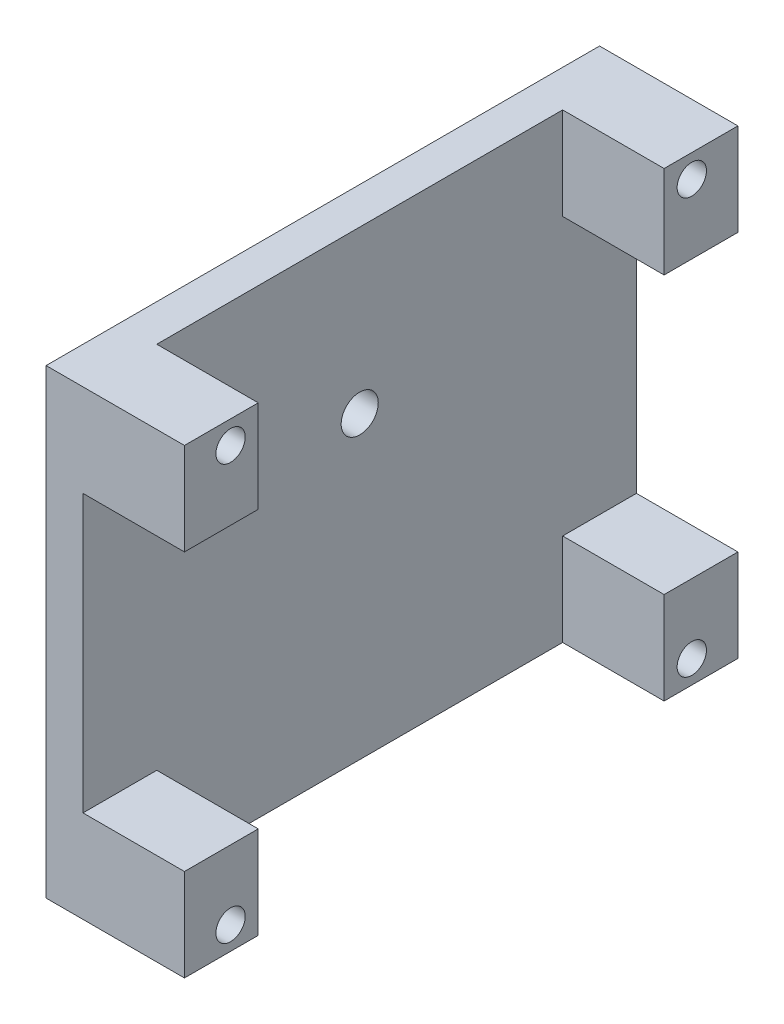
ISO-10303-21;
HEADER;
FILE_DESCRIPTION(('STEP AP214'),'2;1');
FILE_NAME('part.step','',(''),(''),'','','');
FILE_SCHEMA(('AUTOMOTIVE_DESIGN { 1 0 10303 214 1 1 1 1 }'));
ENDSEC;
DATA;
#1=APPLICATION_CONTEXT('core data for automotive mechanical design processes');
#2=APPLICATION_PROTOCOL_DEFINITION('international standard','automotive_design',2000,#1);
#3=PRODUCT_CONTEXT('',#1,'mechanical');
#4=PRODUCT('Part','Part','',(#3));
#5=PRODUCT_RELATED_PRODUCT_CATEGORY('part','',(#4));
#6=PRODUCT_DEFINITION_FORMATION('','',#4);
#7=PRODUCT_DEFINITION_CONTEXT('part definition',#1,'design');
#8=PRODUCT_DEFINITION('design','',#6,#7);
#9=PRODUCT_DEFINITION_SHAPE('','',#8);
#10=(LENGTH_UNIT() NAMED_UNIT(*) SI_UNIT(.MILLI.,.METRE.));
#11=(NAMED_UNIT(*) PLANE_ANGLE_UNIT() SI_UNIT($,.RADIAN.));
#12=(NAMED_UNIT(*) SI_UNIT($,.STERADIAN.) SOLID_ANGLE_UNIT());
#13=UNCERTAINTY_MEASURE_WITH_UNIT(LENGTH_MEASURE(1.E-05),#10,'distance_accuracy_value','');
#14=(GEOMETRIC_REPRESENTATION_CONTEXT(3) GLOBAL_UNCERTAINTY_ASSIGNED_CONTEXT((#13)) GLOBAL_UNIT_ASSIGNED_CONTEXT((#10,
#11,#12)) REPRESENTATION_CONTEXT('',''));
#15=CARTESIAN_POINT('',(0.,0.,0.));
#16=DIRECTION('',(0.,0.,1.));
#17=DIRECTION('',(1.,0.,0.));
#18=AXIS2_PLACEMENT_3D('',#15,#16,#17);
#19=CARTESIAN_POINT('',(19.05,0.,0.));
#20=DIRECTION('',(-1.,0.,0.));
#21=DIRECTION('',(0.,0.,1.));
#22=AXIS2_PLACEMENT_3D('',#19,#20,#21);
#23=PLANE('',#22);
#24=CARTESIAN_POINT('',(19.05,-28.575,-31.75));
#25=DIRECTION('',(1.,0.,0.));
#26=DIRECTION('',(0.,0.,-1.));
#27=AXIS2_PLACEMENT_3D('',#24,#25,#26);
#28=CIRCLE('',#27,2.0193);
#29=CARTESIAN_POINT('',(19.05,-28.575,-33.7693));
#30=VERTEX_POINT('',#29);
#31=EDGE_CURVE('E211',#30,#30,#28,.T.);
#32=ORIENTED_EDGE('',*,*,#31,.F.);
#33=EDGE_LOOP('',(#32));
#34=FACE_BOUND('',#33,.T.);
#35=DIRECTION('',(0.,1.,0.));
#36=VECTOR('',#35,1.);
#37=CARTESIAN_POINT('',(19.05,-31.75,-38.1));
#38=LINE('',#37,#36);
#39=CARTESIAN_POINT('',(19.05,-31.75,-38.1));
#40=VERTEX_POINT('',#39);
#41=CARTESIAN_POINT('',(19.05,-19.05,-38.1));
#42=VERTEX_POINT('',#41);
#43=EDGE_CURVE('E270',#40,#42,#38,.T.);
#44=ORIENTED_EDGE('',*,*,#43,.T.);
#45=DIRECTION('',(0.,0.,-1.));
#46=VECTOR('',#45,1.);
#47=CARTESIAN_POINT('',(19.05,-19.05,38.1));
#48=LINE('',#47,#46);
#49=CARTESIAN_POINT('',(19.05,-19.05,-27.94));
#50=VERTEX_POINT('',#49);
#51=EDGE_CURVE('E183',#50,#42,#48,.T.);
#52=ORIENTED_EDGE('',*,*,#51,.F.);
#53=DIRECTION('',(0.,1.,0.));
#54=VECTOR('',#53,1.);
#55=CARTESIAN_POINT('',(19.05,-31.75,-27.94));
#56=LINE('',#55,#54);
#57=CARTESIAN_POINT('',(19.05,-31.75,-27.94));
#58=VERTEX_POINT('',#57);
#59=EDGE_CURVE('E253',#58,#50,#56,.T.);
#60=ORIENTED_EDGE('',*,*,#59,.F.);
#61=DIRECTION('',(0.,0.,-1.));
#62=VECTOR('',#61,1.);
#63=CARTESIAN_POINT('',(19.05,-31.75,38.1));
#64=LINE('',#63,#62);
#65=EDGE_CURVE('E281',#58,#40,#64,.T.);
#66=ORIENTED_EDGE('',*,*,#65,.T.);
#67=EDGE_LOOP('',(#44,#52,#60,#66));
#68=FACE_BOUND('',#67,.T.);
#69=ADVANCED_FACE('F39',(#34,#68),#23,.F.);
#70=CARTESIAN_POINT('',(19.05,-28.575,31.75));
#71=DIRECTION('',(1.,0.,0.));
#72=DIRECTION('',(0.,0.,-1.));
#73=AXIS2_PLACEMENT_3D('',#70,#71,#72);
#74=CIRCLE('',#73,2.0193);
#75=CARTESIAN_POINT('',(19.05,-28.575,29.7307));
#76=VERTEX_POINT('',#75);
#77=EDGE_CURVE('E217',#76,#76,#74,.T.);
#78=ORIENTED_EDGE('',*,*,#77,.F.);
#79=EDGE_LOOP('',(#78));
#80=FACE_BOUND('',#79,.T.);
#81=DIRECTION('',(0.,-1.,0.));
#82=VECTOR('',#81,1.);
#83=CARTESIAN_POINT('',(19.05,-31.75,27.94));
#84=LINE('',#83,#82);
#85=CARTESIAN_POINT('',(19.05,-19.05,27.94));
#86=VERTEX_POINT('',#85);
#87=CARTESIAN_POINT('',(19.05,-31.75,27.94));
#88=VERTEX_POINT('',#87);
#89=EDGE_CURVE('E256',#86,#88,#84,.T.);
#90=ORIENTED_EDGE('',*,*,#89,.F.);
#91=CARTESIAN_POINT('',(19.05,-19.05,38.1));
#92=VERTEX_POINT('',#91);
#93=EDGE_CURVE('E334',#92,#86,#48,.T.);
#94=ORIENTED_EDGE('',*,*,#93,.F.);
#95=DIRECTION('',(0.,-1.,0.));
#96=VECTOR('',#95,1.);
#97=CARTESIAN_POINT('',(19.05,-31.75,38.1));
#98=LINE('',#97,#96);
#99=CARTESIAN_POINT('',(19.05,-31.75,38.1));
#100=VERTEX_POINT('',#99);
#101=EDGE_CURVE('E277',#92,#100,#98,.T.);
#102=ORIENTED_EDGE('',*,*,#101,.T.);
#103=EDGE_CURVE('E282',#100,#88,#64,.T.);
#104=ORIENTED_EDGE('',*,*,#103,.T.);
#105=EDGE_LOOP('',(#90,#94,#102,#104));
#106=FACE_BOUND('',#105,.T.);
#107=ADVANCED_FACE('F332',(#80,#106),#23,.F.);
#108=CARTESIAN_POINT('',(5.08,-31.75,-27.94));
#109=DIRECTION('',(0.,0.,-1.));
#110=DIRECTION('',(-1.,0.,0.));
#111=AXIS2_PLACEMENT_3D('',#108,#109,#110);
#112=PLANE('',#111);
#113=ORIENTED_EDGE('',*,*,#59,.T.);
#114=DIRECTION('',(-1.,0.,0.));
#115=VECTOR('',#114,1.);
#116=CARTESIAN_POINT('',(5.08,-19.05,-27.94));
#117=LINE('',#116,#115);
#118=CARTESIAN_POINT('',(5.08,-19.05,-27.94));
#119=VERTEX_POINT('',#118);
#120=EDGE_CURVE('E209',#50,#119,#117,.T.);
#121=ORIENTED_EDGE('',*,*,#120,.T.);
#122=DIRECTION('',(0.,1.,0.));
#123=VECTOR('',#122,1.);
#124=CARTESIAN_POINT('',(5.08,-31.75,-27.94));
#125=LINE('',#124,#123);
#126=CARTESIAN_POINT('',(5.08,-31.75,-27.94));
#127=VERTEX_POINT('',#126);
#128=EDGE_CURVE('E174',#127,#119,#125,.T.);
#129=ORIENTED_EDGE('',*,*,#128,.F.);
#130=DIRECTION('',(1.,0.,0.));
#131=VECTOR('',#130,1.);
#132=CARTESIAN_POINT('',(5.08,-31.75,-27.94));
#133=LINE('',#132,#131);
#134=EDGE_CURVE('E260',#127,#58,#133,.T.);
#135=ORIENTED_EDGE('',*,*,#134,.T.);
#136=EDGE_LOOP('',(#113,#121,#129,#135));
#137=FACE_BOUND('',#136,.T.);
#138=ADVANCED_FACE('F323',(#137),#112,.F.);
#139=CARTESIAN_POINT('',(5.08,-31.75,27.94));
#140=DIRECTION('',(0.,0.,1.));
#141=DIRECTION('',(1.,0.,0.));
#142=AXIS2_PLACEMENT_3D('',#139,#140,#141);
#143=PLANE('',#142);
#144=DIRECTION('',(0.,-1.,0.));
#145=VECTOR('',#144,1.);
#146=CARTESIAN_POINT('',(5.08,-31.75,27.94));
#147=LINE('',#146,#145);
#148=CARTESIAN_POINT('',(5.08,-19.05,27.94));
#149=VERTEX_POINT('',#148);
#150=CARTESIAN_POINT('',(5.08,-31.75,27.94));
#151=VERTEX_POINT('',#150);
#152=EDGE_CURVE('E247',#149,#151,#147,.T.);
#153=ORIENTED_EDGE('',*,*,#152,.F.);
#154=DIRECTION('',(1.,0.,0.));
#155=VECTOR('',#154,1.);
#156=CARTESIAN_POINT('',(5.08,-19.05,27.94));
#157=LINE('',#156,#155);
#158=EDGE_CURVE('E206',#149,#86,#157,.T.);
#159=ORIENTED_EDGE('',*,*,#158,.T.);
#160=ORIENTED_EDGE('',*,*,#89,.T.);
#161=DIRECTION('',(1.,0.,0.));
#162=VECTOR('',#161,1.);
#163=CARTESIAN_POINT('',(5.08,-31.75,27.94));
#164=LINE('',#163,#162);
#165=EDGE_CURVE('E263',#151,#88,#164,.T.);
#166=ORIENTED_EDGE('',*,*,#165,.F.);
#167=EDGE_LOOP('',(#153,#159,#160,#166));
#168=FACE_BOUND('',#167,.T.);
#169=ADVANCED_FACE('F329',(#168),#143,.F.);
#170=CARTESIAN_POINT('',(19.05,28.575,-31.75));
#171=DIRECTION('',(1.,0.,0.));
#172=DIRECTION('',(0.,0.,-1.));
#173=AXIS2_PLACEMENT_3D('',#170,#171,#172);
#174=CIRCLE('',#173,2.0193);
#175=CARTESIAN_POINT('',(19.05,28.575,-33.7693));
#176=VERTEX_POINT('',#175);
#177=EDGE_CURVE('E223',#176,#176,#174,.T.);
#178=ORIENTED_EDGE('',*,*,#177,.F.);
#179=EDGE_LOOP('',(#178));
#180=FACE_BOUND('',#179,.T.);
#181=CARTESIAN_POINT('',(19.05,19.05,-27.94));
#182=VERTEX_POINT('',#181);
#183=CARTESIAN_POINT('',(19.05,31.75,-27.94));
#184=VERTEX_POINT('',#183);
#185=EDGE_CURVE('E241',#182,#184,#56,.T.);
#186=ORIENTED_EDGE('',*,*,#185,.F.);
#187=DIRECTION('',(0.,0.,1.));
#188=VECTOR('',#187,1.);
#189=CARTESIAN_POINT('',(19.05,19.05,38.1));
#190=LINE('',#189,#188);
#191=CARTESIAN_POINT('',(19.05,19.05,-38.1));
#192=VERTEX_POINT('',#191);
#193=EDGE_CURVE('E54',#192,#182,#190,.T.);
#194=ORIENTED_EDGE('',*,*,#193,.F.);
#195=CARTESIAN_POINT('',(19.05,31.75,-38.1));
#196=VERTEX_POINT('',#195);
#197=EDGE_CURVE('E273',#192,#196,#38,.T.);
#198=ORIENTED_EDGE('',*,*,#197,.T.);
#199=DIRECTION('',(0.,0.,1.));
#200=VECTOR('',#199,1.);
#201=CARTESIAN_POINT('',(19.05,31.75,38.1));
#202=LINE('',#201,#200);
#203=EDGE_CURVE('E274',#196,#184,#202,.T.);
#204=ORIENTED_EDGE('',*,*,#203,.T.);
#205=EDGE_LOOP('',(#186,#194,#198,#204));
#206=FACE_BOUND('',#205,.T.);
#207=ADVANCED_FACE('F359',(#180,#206),#23,.F.);
#208=CARTESIAN_POINT('',(19.05,-31.75,-38.1));
#209=DIRECTION('',(0.,0.,1.));
#210=DIRECTION('',(1.,0.,0.));
#211=AXIS2_PLACEMENT_3D('',#208,#209,#210);
#212=PLANE('',#211);
#213=DIRECTION('',(0.,1.,0.));
#214=VECTOR('',#213,1.);
#215=CARTESIAN_POINT('',(5.08,19.05,-38.1));
#216=LINE('',#215,#214);
#217=CARTESIAN_POINT('',(5.08,-19.05,-38.1));
#218=VERTEX_POINT('',#217);
#219=CARTESIAN_POINT('',(5.08,19.05,-38.1));
#220=VERTEX_POINT('',#219);
#221=EDGE_CURVE('E171',#218,#220,#216,.T.);
#222=ORIENTED_EDGE('',*,*,#221,.F.);
#223=DIRECTION('',(1.,0.,0.));
#224=VECTOR('',#223,1.);
#225=CARTESIAN_POINT('',(-80.114189942742,-19.05,-38.1));
#226=LINE('',#225,#224);
#227=EDGE_CURVE('E180',#218,#42,#226,.T.);
#228=ORIENTED_EDGE('',*,*,#227,.T.);
#229=ORIENTED_EDGE('',*,*,#43,.F.);
#230=DIRECTION('',(-1.,0.,0.));
#231=VECTOR('',#230,1.);
#232=CARTESIAN_POINT('',(19.05,-31.75,-38.1));
#233=LINE('',#232,#231);
#234=CARTESIAN_POINT('',(0.,-31.75,-38.1));
#235=VERTEX_POINT('',#234);
#236=EDGE_CURVE('E285',#40,#235,#233,.T.);
#237=ORIENTED_EDGE('',*,*,#236,.T.);
#238=DIRECTION('',(0.,1.,0.));
#239=VECTOR('',#238,1.);
#240=CARTESIAN_POINT('',(0.,-31.75,-38.1));
#241=LINE('',#240,#239);
#242=CARTESIAN_POINT('',(0.,31.75,-38.1));
#243=VERTEX_POINT('',#242);
#244=EDGE_CURVE('E262',#235,#243,#241,.T.);
#245=ORIENTED_EDGE('',*,*,#244,.T.);
#246=DIRECTION('',(-1.,0.,0.));
#247=VECTOR('',#246,1.);
#248=CARTESIAN_POINT('',(19.05,31.75,-38.1));
#249=LINE('',#248,#247);
#250=EDGE_CURVE('E11',#196,#243,#249,.T.);
#251=ORIENTED_EDGE('',*,*,#250,.F.);
#252=ORIENTED_EDGE('',*,*,#197,.F.);
#253=DIRECTION('',(1.,0.,0.));
#254=VECTOR('',#253,1.);
#255=CARTESIAN_POINT('',(-80.114189942742,19.05,-38.1));
#256=LINE('',#255,#254);
#257=EDGE_CURVE('E189',#220,#192,#256,.T.);
#258=ORIENTED_EDGE('',*,*,#257,.F.);
#259=EDGE_LOOP('',(#222,#228,#229,#237,#245,#251,#252,#258));
#260=FACE_BOUND('',#259,.T.);
#261=ADVANCED_FACE('F41',(#260),#212,.F.);
#262=CARTESIAN_POINT('',(19.05,31.75,38.1));
#263=DIRECTION('',(0.,-1.,0.));
#264=DIRECTION('',(0.,0.,-1.));
#265=AXIS2_PLACEMENT_3D('',#262,#263,#264);
#266=PLANE('',#265);
#267=DIRECTION('',(0.,0.,1.));
#268=VECTOR('',#267,1.);
#269=CARTESIAN_POINT('',(5.08,31.75,27.94));
#270=LINE('',#269,#268);
#271=CARTESIAN_POINT('',(5.08,31.75,-27.94));
#272=VERTEX_POINT('',#271);
#273=CARTESIAN_POINT('',(5.08,31.75,27.94));
#274=VERTEX_POINT('',#273);
#275=EDGE_CURVE('E243',#272,#274,#270,.T.);
#276=ORIENTED_EDGE('',*,*,#275,.F.);
#277=DIRECTION('',(1.,0.,0.));
#278=VECTOR('',#277,1.);
#279=CARTESIAN_POINT('',(5.08,31.75,-27.94));
#280=LINE('',#279,#278);
#281=EDGE_CURVE('E252',#272,#184,#280,.T.);
#282=ORIENTED_EDGE('',*,*,#281,.T.);
#283=ORIENTED_EDGE('',*,*,#203,.F.);
#284=ORIENTED_EDGE('',*,*,#250,.T.);
#285=DIRECTION('',(0.,0.,1.));
#286=VECTOR('',#285,1.);
#287=CARTESIAN_POINT('',(0.,31.75,38.1));
#288=LINE('',#287,#286);
#289=CARTESIAN_POINT('',(0.,31.75,38.1));
#290=VERTEX_POINT('',#289);
#291=EDGE_CURVE('E288',#243,#290,#288,.T.);
#292=ORIENTED_EDGE('',*,*,#291,.T.);
#293=DIRECTION('',(-1.,0.,0.));
#294=VECTOR('',#293,1.);
#295=CARTESIAN_POINT('',(19.05,31.75,38.1));
#296=LINE('',#295,#294);
#297=CARTESIAN_POINT('',(19.05,31.75,38.1));
#298=VERTEX_POINT('',#297);
#299=EDGE_CURVE('E47',#298,#290,#296,.T.);
#300=ORIENTED_EDGE('',*,*,#299,.F.);
#301=CARTESIAN_POINT('',(19.05,31.75,27.94));
#302=VERTEX_POINT('',#301);
#303=EDGE_CURVE('E272',#302,#298,#202,.T.);
#304=ORIENTED_EDGE('',*,*,#303,.F.);
#305=DIRECTION('',(1.,0.,0.));
#306=VECTOR('',#305,1.);
#307=CARTESIAN_POINT('',(5.08,31.75,27.94));
#308=LINE('',#307,#306);
#309=EDGE_CURVE('E266',#274,#302,#308,.T.);
#310=ORIENTED_EDGE('',*,*,#309,.F.);
#311=EDGE_LOOP('',(#276,#282,#283,#284,#292,#300,#304,#310));
#312=FACE_BOUND('',#311,.T.);
#313=ADVANCED_FACE('F349',(#312),#266,.F.);
#314=CARTESIAN_POINT('',(19.05,-31.75,38.1));
#315=DIRECTION('',(0.,0.,-1.));
#316=DIRECTION('',(-1.,0.,0.));
#317=AXIS2_PLACEMENT_3D('',#314,#315,#316);
#318=PLANE('',#317);
#319=ORIENTED_EDGE('',*,*,#101,.F.);
#320=DIRECTION('',(1.,0.,0.));
#321=VECTOR('',#320,1.);
#322=CARTESIAN_POINT('',(-80.114189942742,-19.05,38.1));
#323=LINE('',#322,#321);
#324=CARTESIAN_POINT('',(5.08,-19.05,38.1));
#325=VERTEX_POINT('',#324);
#326=EDGE_CURVE('E200',#325,#92,#323,.T.);
#327=ORIENTED_EDGE('',*,*,#326,.F.);
#328=DIRECTION('',(0.,-1.,0.));
#329=VECTOR('',#328,1.);
#330=CARTESIAN_POINT('',(5.08,19.05,38.1));
#331=LINE('',#330,#329);
#332=CARTESIAN_POINT('',(5.08,19.05,38.1));
#333=VERTEX_POINT('',#332);
#334=EDGE_CURVE('E198',#333,#325,#331,.T.);
#335=ORIENTED_EDGE('',*,*,#334,.F.);
#336=DIRECTION('',(1.,0.,0.));
#337=VECTOR('',#336,1.);
#338=CARTESIAN_POINT('',(-80.114189942742,19.05,38.1));
#339=LINE('',#338,#337);
#340=CARTESIAN_POINT('',(19.05,19.05,38.1));
#341=VERTEX_POINT('',#340);
#342=EDGE_CURVE('E196',#333,#341,#339,.T.);
#343=ORIENTED_EDGE('',*,*,#342,.T.);
#344=EDGE_CURVE('E278',#298,#341,#98,.T.);
#345=ORIENTED_EDGE('',*,*,#344,.F.);
#346=ORIENTED_EDGE('',*,*,#299,.T.);
#347=DIRECTION('',(0.,-1.,0.));
#348=VECTOR('',#347,1.);
#349=CARTESIAN_POINT('',(0.,-31.75,38.1));
#350=LINE('',#349,#348);
#351=CARTESIAN_POINT('',(0.,-31.75,38.1));
#352=VERTEX_POINT('',#351);
#353=EDGE_CURVE('E290',#290,#352,#350,.T.);
#354=ORIENTED_EDGE('',*,*,#353,.T.);
#355=DIRECTION('',(-1.,0.,0.));
#356=VECTOR('',#355,1.);
#357=CARTESIAN_POINT('',(19.05,-31.75,38.1));
#358=LINE('',#357,#356);
#359=EDGE_CURVE('E296',#100,#352,#358,.T.);
#360=ORIENTED_EDGE('',*,*,#359,.F.);
#361=EDGE_LOOP('',(#319,#327,#335,#343,#345,#346,#354,#360));
#362=FACE_BOUND('',#361,.T.);
#363=ADVANCED_FACE('F304',(#362),#318,.F.);
#364=CARTESIAN_POINT('',(19.05,-31.75,38.1));
#365=DIRECTION('',(0.,1.,0.));
#366=DIRECTION('',(0.,0.,1.));
#367=AXIS2_PLACEMENT_3D('',#364,#365,#366);
#368=PLANE('',#367);
#369=ORIENTED_EDGE('',*,*,#65,.F.);
#370=ORIENTED_EDGE('',*,*,#134,.F.);
#371=DIRECTION('',(0.,0.,-1.));
#372=VECTOR('',#371,1.);
#373=CARTESIAN_POINT('',(5.08,-31.75,27.94));
#374=LINE('',#373,#372);
#375=EDGE_CURVE('E250',#151,#127,#374,.T.);
#376=ORIENTED_EDGE('',*,*,#375,.F.);
#377=ORIENTED_EDGE('',*,*,#165,.T.);
#378=ORIENTED_EDGE('',*,*,#103,.F.);
#379=ORIENTED_EDGE('',*,*,#359,.T.);
#380=DIRECTION('',(0.,0.,-1.));
#381=VECTOR('',#380,1.);
#382=CARTESIAN_POINT('',(0.,-31.75,38.1));
#383=LINE('',#382,#381);
#384=EDGE_CURVE('E292',#352,#235,#383,.T.);
#385=ORIENTED_EDGE('',*,*,#384,.T.);
#386=ORIENTED_EDGE('',*,*,#236,.F.);
#387=EDGE_LOOP('',(#369,#370,#376,#377,#378,#379,#385,#386));
#388=FACE_BOUND('',#387,.T.);
#389=ADVANCED_FACE('F315',(#388),#368,.F.);
#390=CARTESIAN_POINT('',(19.05,28.575,31.75));
#391=DIRECTION('',(1.,0.,0.));
#392=DIRECTION('',(0.,0.,-1.));
#393=AXIS2_PLACEMENT_3D('',#390,#391,#392);
#394=CIRCLE('',#393,2.0193);
#395=CARTESIAN_POINT('',(19.05,28.575,29.7307));
#396=VERTEX_POINT('',#395);
#397=EDGE_CURVE('E235',#396,#396,#394,.T.);
#398=ORIENTED_EDGE('',*,*,#397,.F.);
#399=EDGE_LOOP('',(#398));
#400=FACE_BOUND('',#399,.T.);
#401=ORIENTED_EDGE('',*,*,#344,.T.);
#402=CARTESIAN_POINT('',(19.05,19.05,27.94));
#403=VERTEX_POINT('',#402);
#404=EDGE_CURVE('E341',#403,#341,#190,.T.);
#405=ORIENTED_EDGE('',*,*,#404,.F.);
#406=EDGE_CURVE('E257',#302,#403,#84,.T.);
#407=ORIENTED_EDGE('',*,*,#406,.F.);
#408=ORIENTED_EDGE('',*,*,#303,.T.);
#409=EDGE_LOOP('',(#401,#405,#407,#408));
#410=FACE_BOUND('',#409,.T.);
#411=ADVANCED_FACE('F346',(#400,#410),#23,.F.);
#412=CARTESIAN_POINT('',(0.,0.,0.));
#413=DIRECTION('',(-1.,0.,0.));
#414=DIRECTION('',(0.,0.,1.));
#415=AXIS2_PLACEMENT_3D('',#412,#413,#414);
#416=PLANE('',#415);
#417=CARTESIAN_POINT('',(0.,9.525,0.));
#418=DIRECTION('',(-1.,0.,0.));
#419=DIRECTION('',(0.,0.,1.));
#420=AXIS2_PLACEMENT_3D('',#417,#418,#419);
#421=CIRCLE('',#420,2.55269999999999);
#422=CARTESIAN_POINT('',(0.,9.525,2.55269999999999));
#423=VERTEX_POINT('',#422);
#424=EDGE_CURVE('E232',#423,#423,#421,.T.);
#425=ORIENTED_EDGE('',*,*,#424,.F.);
#426=EDGE_LOOP('',(#425));
#427=FACE_BOUND('',#426,.T.);
#428=ORIENTED_EDGE('',*,*,#244,.F.);
#429=ORIENTED_EDGE('',*,*,#384,.F.);
#430=ORIENTED_EDGE('',*,*,#353,.F.);
#431=ORIENTED_EDGE('',*,*,#291,.F.);
#432=EDGE_LOOP('',(#428,#429,#430,#431));
#433=FACE_BOUND('',#432,.T.);
#434=ADVANCED_FACE('F311',(#427,#433),#416,.T.);
#435=CARTESIAN_POINT('',(5.08,19.05,-27.94));
#436=VERTEX_POINT('',#435);
#437=EDGE_CURVE('E244',#436,#272,#125,.T.);
#438=ORIENTED_EDGE('',*,*,#437,.F.);
#439=DIRECTION('',(1.,0.,0.));
#440=VECTOR('',#439,1.);
#441=CARTESIAN_POINT('',(5.08,19.05,-27.94));
#442=LINE('',#441,#440);
#443=EDGE_CURVE('E204',#436,#182,#442,.T.);
#444=ORIENTED_EDGE('',*,*,#443,.T.);
#445=ORIENTED_EDGE('',*,*,#185,.T.);
#446=ORIENTED_EDGE('',*,*,#281,.F.);
#447=EDGE_LOOP('',(#438,#444,#445,#446));
#448=FACE_BOUND('',#447,.T.);
#449=ADVANCED_FACE('F355',(#448),#112,.F.);
#450=ORIENTED_EDGE('',*,*,#406,.T.);
#451=DIRECTION('',(-1.,0.,0.));
#452=VECTOR('',#451,1.);
#453=CARTESIAN_POINT('',(5.08,19.05,27.94));
#454=LINE('',#453,#452);
#455=CARTESIAN_POINT('',(5.08,19.05,27.94));
#456=VERTEX_POINT('',#455);
#457=EDGE_CURVE('E202',#403,#456,#454,.T.);
#458=ORIENTED_EDGE('',*,*,#457,.T.);
#459=EDGE_CURVE('E248',#274,#456,#147,.T.);
#460=ORIENTED_EDGE('',*,*,#459,.F.);
#461=ORIENTED_EDGE('',*,*,#309,.T.);
#462=EDGE_LOOP('',(#450,#458,#460,#461));
#463=FACE_BOUND('',#462,.T.);
#464=ADVANCED_FACE('F351',(#463),#143,.F.);
#465=CARTESIAN_POINT('',(5.08,0.,0.));
#466=DIRECTION('',(-1.,0.,0.));
#467=DIRECTION('',(0.,0.,1.));
#468=AXIS2_PLACEMENT_3D('',#465,#466,#467);
#469=PLANE('',#468);
#470=ORIENTED_EDGE('',*,*,#459,.T.);
#471=DIRECTION('',(0.,0.,1.));
#472=VECTOR('',#471,1.);
#473=CARTESIAN_POINT('',(5.08,19.05,38.1));
#474=LINE('',#473,#472);
#475=EDGE_CURVE('E62',#456,#333,#474,.T.);
#476=ORIENTED_EDGE('',*,*,#475,.T.);
#477=ORIENTED_EDGE('',*,*,#334,.T.);
#478=DIRECTION('',(0.,0.,-1.));
#479=VECTOR('',#478,1.);
#480=CARTESIAN_POINT('',(5.08,-19.05,38.1));
#481=LINE('',#480,#479);
#482=EDGE_CURVE('E177',#325,#149,#481,.T.);
#483=ORIENTED_EDGE('',*,*,#482,.T.);
#484=ORIENTED_EDGE('',*,*,#152,.T.);
#485=ORIENTED_EDGE('',*,*,#375,.T.);
#486=ORIENTED_EDGE('',*,*,#128,.T.);
#487=EDGE_CURVE('E164',#119,#218,#481,.T.);
#488=ORIENTED_EDGE('',*,*,#487,.T.);
#489=ORIENTED_EDGE('',*,*,#221,.T.);
#490=EDGE_CURVE('E194',#220,#436,#474,.T.);
#491=ORIENTED_EDGE('',*,*,#490,.T.);
#492=ORIENTED_EDGE('',*,*,#437,.T.);
#493=ORIENTED_EDGE('',*,*,#275,.T.);
#494=EDGE_LOOP('',(#470,#476,#477,#483,#484,#485,#486,#488,#489,#491,#492,#493));
#495=FACE_BOUND('',#494,.T.);
#496=CARTESIAN_POINT('',(5.08,9.525,0.));
#497=DIRECTION('',(1.,0.,0.));
#498=DIRECTION('',(0.,0.,-1.));
#499=AXIS2_PLACEMENT_3D('',#496,#497,#498);
#500=CIRCLE('',#499,2.55269999999999);
#501=CARTESIAN_POINT('',(5.08,9.525,-2.55269999999999));
#502=VERTEX_POINT('',#501);
#503=EDGE_CURVE('E229',#502,#502,#500,.T.);
#504=ORIENTED_EDGE('',*,*,#503,.F.);
#505=EDGE_LOOP('',(#504));
#506=FACE_BOUND('',#505,.T.);
#507=ADVANCED_FACE('F167',(#495,#506),#469,.F.);
#508=CARTESIAN_POINT('',(5.334,28.575,31.75));
#509=DIRECTION('',(1.,0.,0.));
#510=DIRECTION('',(0.,0.,-1.));
#511=AXIS2_PLACEMENT_3D('',#508,#509,#510);
#512=CONICAL_SURFACE('',#511,2.0193,1.02974425867665);
#513=CARTESIAN_POINT('',(4.12068215199765,28.575,31.75));
#514=VERTEX_POINT('',#513);
#515=VERTEX_LOOP('',#514);
#516=FACE_BOUND('',#515,.T.);
#517=CARTESIAN_POINT('',(5.334,28.575,31.75));
#518=DIRECTION('',(1.,0.,0.));
#519=DIRECTION('',(0.,0.,-1.));
#520=AXIS2_PLACEMENT_3D('',#517,#518,#519);
#521=CIRCLE('',#520,2.0193);
#522=CARTESIAN_POINT('',(5.334,28.575,29.7307));
#523=VERTEX_POINT('',#522);
#524=EDGE_CURVE('E238',#523,#523,#521,.T.);
#525=ORIENTED_EDGE('',*,*,#524,.T.);
#526=EDGE_LOOP('',(#525));
#527=FACE_BOUND('',#526,.T.);
#528=ADVANCED_FACE('F419',(#516,#527),#512,.F.);
#529=CARTESIAN_POINT('',(19.05,28.575,31.75));
#530=DIRECTION('',(1.,0.,0.));
#531=DIRECTION('',(0.,0.,-1.));
#532=AXIS2_PLACEMENT_3D('',#529,#530,#531);
#533=CYLINDRICAL_SURFACE('',#532,2.0193);
#534=ORIENTED_EDGE('',*,*,#524,.F.);
#535=EDGE_LOOP('',(#534));
#536=FACE_BOUND('',#535,.T.);
#537=ORIENTED_EDGE('',*,*,#397,.T.);
#538=EDGE_LOOP('',(#537));
#539=FACE_BOUND('',#538,.T.);
#540=ADVANCED_FACE('F415',(#536,#539),#533,.F.);
#541=CARTESIAN_POINT('',(5.08,9.525,0.));
#542=DIRECTION('',(1.,0.,0.));
#543=DIRECTION('',(0.,0.,-1.));
#544=AXIS2_PLACEMENT_3D('',#541,#542,#543);
#545=CYLINDRICAL_SURFACE('',#544,2.55269999999999);
#546=ORIENTED_EDGE('',*,*,#424,.T.);
#547=EDGE_LOOP('',(#546));
#548=FACE_BOUND('',#547,.T.);
#549=ORIENTED_EDGE('',*,*,#503,.T.);
#550=EDGE_LOOP('',(#549));
#551=FACE_BOUND('',#550,.T.);
#552=ADVANCED_FACE('F411',(#548,#551),#545,.F.);
#553=CARTESIAN_POINT('',(5.334,28.575,-31.75));
#554=DIRECTION('',(1.,0.,0.));
#555=DIRECTION('',(0.,0.,-1.));
#556=AXIS2_PLACEMENT_3D('',#553,#554,#555);
#557=CONICAL_SURFACE('',#556,2.0193,1.02974425867665);
#558=CARTESIAN_POINT('',(4.12068215199765,28.575,-31.75));
#559=VERTEX_POINT('',#558);
#560=VERTEX_LOOP('',#559);
#561=FACE_BOUND('',#560,.T.);
#562=CARTESIAN_POINT('',(5.334,28.575,-31.75));
#563=DIRECTION('',(1.,0.,0.));
#564=DIRECTION('',(0.,0.,-1.));
#565=AXIS2_PLACEMENT_3D('',#562,#563,#564);
#566=CIRCLE('',#565,2.0193);
#567=CARTESIAN_POINT('',(5.334,28.575,-33.7693));
#568=VERTEX_POINT('',#567);
#569=EDGE_CURVE('E226',#568,#568,#566,.T.);
#570=ORIENTED_EDGE('',*,*,#569,.T.);
#571=EDGE_LOOP('',(#570));
#572=FACE_BOUND('',#571,.T.);
#573=ADVANCED_FACE('F407',(#561,#572),#557,.F.);
#574=CARTESIAN_POINT('',(19.05,28.575,-31.75));
#575=DIRECTION('',(1.,0.,0.));
#576=DIRECTION('',(0.,0.,-1.));
#577=AXIS2_PLACEMENT_3D('',#574,#575,#576);
#578=CYLINDRICAL_SURFACE('',#577,2.0193);
#579=ORIENTED_EDGE('',*,*,#569,.F.);
#580=EDGE_LOOP('',(#579));
#581=FACE_BOUND('',#580,.T.);
#582=ORIENTED_EDGE('',*,*,#177,.T.);
#583=EDGE_LOOP('',(#582));
#584=FACE_BOUND('',#583,.T.);
#585=ADVANCED_FACE('F403',(#581,#584),#578,.F.);
#586=CARTESIAN_POINT('',(5.334,-28.575,31.75));
#587=DIRECTION('',(1.,0.,0.));
#588=DIRECTION('',(0.,0.,-1.));
#589=AXIS2_PLACEMENT_3D('',#586,#587,#588);
#590=CONICAL_SURFACE('',#589,2.0193,1.02974425867665);
#591=CARTESIAN_POINT('',(4.12068215199765,-28.575,31.75));
#592=VERTEX_POINT('',#591);
#593=VERTEX_LOOP('',#592);
#594=FACE_BOUND('',#593,.T.);
#595=CARTESIAN_POINT('',(5.334,-28.575,31.75));
#596=DIRECTION('',(1.,0.,0.));
#597=DIRECTION('',(0.,0.,-1.));
#598=AXIS2_PLACEMENT_3D('',#595,#596,#597);
#599=CIRCLE('',#598,2.0193);
#600=CARTESIAN_POINT('',(5.334,-28.575,29.7307));
#601=VERTEX_POINT('',#600);
#602=EDGE_CURVE('E220',#601,#601,#599,.T.);
#603=ORIENTED_EDGE('',*,*,#602,.T.);
#604=EDGE_LOOP('',(#603));
#605=FACE_BOUND('',#604,.T.);
#606=ADVANCED_FACE('F399',(#594,#605),#590,.F.);
#607=CARTESIAN_POINT('',(19.05,-28.575,31.75));
#608=DIRECTION('',(1.,0.,0.));
#609=DIRECTION('',(0.,0.,-1.));
#610=AXIS2_PLACEMENT_3D('',#607,#608,#609);
#611=CYLINDRICAL_SURFACE('',#610,2.0193);
#612=ORIENTED_EDGE('',*,*,#602,.F.);
#613=EDGE_LOOP('',(#612));
#614=FACE_BOUND('',#613,.T.);
#615=ORIENTED_EDGE('',*,*,#77,.T.);
#616=EDGE_LOOP('',(#615));
#617=FACE_BOUND('',#616,.T.);
#618=ADVANCED_FACE('F391',(#614,#617),#611,.F.);
#619=CARTESIAN_POINT('',(5.334,-28.575,-31.75));
#620=DIRECTION('',(1.,0.,0.));
#621=DIRECTION('',(0.,0.,-1.));
#622=AXIS2_PLACEMENT_3D('',#619,#620,#621);
#623=CONICAL_SURFACE('',#622,2.0193,1.02974425867665);
#624=CARTESIAN_POINT('',(4.12068215199765,-28.575,-31.75));
#625=VERTEX_POINT('',#624);
#626=VERTEX_LOOP('',#625);
#627=FACE_BOUND('',#626,.T.);
#628=CARTESIAN_POINT('',(5.334,-28.575,-31.75));
#629=DIRECTION('',(1.,0.,0.));
#630=DIRECTION('',(0.,0.,-1.));
#631=AXIS2_PLACEMENT_3D('',#628,#629,#630);
#632=CIRCLE('',#631,2.0193);
#633=CARTESIAN_POINT('',(5.334,-28.575,-33.7693));
#634=VERTEX_POINT('',#633);
#635=EDGE_CURVE('E214',#634,#634,#632,.T.);
#636=ORIENTED_EDGE('',*,*,#635,.T.);
#637=EDGE_LOOP('',(#636));
#638=FACE_BOUND('',#637,.T.);
#639=ADVANCED_FACE('F383',(#627,#638),#623,.F.);
#640=CARTESIAN_POINT('',(19.05,-28.575,-31.75));
#641=DIRECTION('',(1.,0.,0.));
#642=DIRECTION('',(0.,0.,-1.));
#643=AXIS2_PLACEMENT_3D('',#640,#641,#642);
#644=CYLINDRICAL_SURFACE('',#643,2.0193);
#645=ORIENTED_EDGE('',*,*,#635,.F.);
#646=EDGE_LOOP('',(#645));
#647=FACE_BOUND('',#646,.T.);
#648=ORIENTED_EDGE('',*,*,#31,.T.);
#649=EDGE_LOOP('',(#648));
#650=FACE_BOUND('',#649,.T.);
#651=ADVANCED_FACE('F381',(#647,#650),#644,.F.);
#652=CARTESIAN_POINT('',(-80.114189942742,-19.05,38.1));
#653=DIRECTION('',(0.,-1.,0.));
#654=DIRECTION('',(0.,0.,-1.));
#655=AXIS2_PLACEMENT_3D('',#652,#653,#654);
#656=PLANE('',#655);
#657=ORIENTED_EDGE('',*,*,#482,.F.);
#658=ORIENTED_EDGE('',*,*,#326,.T.);
#659=ORIENTED_EDGE('',*,*,#93,.T.);
#660=ORIENTED_EDGE('',*,*,#158,.F.);
#661=EDGE_LOOP('',(#657,#658,#659,#660));
#662=FACE_BOUND('',#661,.T.);
#663=ADVANCED_FACE('F338',(#662),#656,.F.);
#664=CARTESIAN_POINT('',(-80.114189942742,19.05,38.1));
#665=DIRECTION('',(0.,1.,0.));
#666=DIRECTION('',(0.,0.,1.));
#667=AXIS2_PLACEMENT_3D('',#664,#665,#666);
#668=PLANE('',#667);
#669=ORIENTED_EDGE('',*,*,#404,.T.);
#670=ORIENTED_EDGE('',*,*,#342,.F.);
#671=ORIENTED_EDGE('',*,*,#475,.F.);
#672=ORIENTED_EDGE('',*,*,#457,.F.);
#673=EDGE_LOOP('',(#669,#670,#671,#672));
#674=FACE_BOUND('',#673,.T.);
#675=ADVANCED_FACE('F343',(#674),#668,.F.);
#676=ORIENTED_EDGE('',*,*,#51,.T.);
#677=ORIENTED_EDGE('',*,*,#227,.F.);
#678=ORIENTED_EDGE('',*,*,#487,.F.);
#679=ORIENTED_EDGE('',*,*,#120,.F.);
#680=EDGE_LOOP('',(#676,#677,#678,#679));
#681=FACE_BOUND('',#680,.T.);
#682=ADVANCED_FACE('F181',(#681),#656,.F.);
#683=ORIENTED_EDGE('',*,*,#490,.F.);
#684=ORIENTED_EDGE('',*,*,#257,.T.);
#685=ORIENTED_EDGE('',*,*,#193,.T.);
#686=ORIENTED_EDGE('',*,*,#443,.F.);
#687=EDGE_LOOP('',(#683,#684,#685,#686));
#688=FACE_BOUND('',#687,.T.);
#689=ADVANCED_FACE('F503',(#688),#668,.F.);
#690=CLOSED_SHELL('',(#69,#107,#138,#169,#207,#261,#313,#363,#389,#411,#434,#449,#464,#507,#528,
#540,#552,#573,#585,#606,#618,#639,#651,#663,#675,#682,#689));
#691=MANIFOLD_SOLID_BREP('B2',#690);
#692=ADVANCED_BREP_SHAPE_REPRESENTATION('',(#18,#691),#14);
#693=SHAPE_DEFINITION_REPRESENTATION(#9,#692);
ENDSEC;
END-ISO-10303-21;
